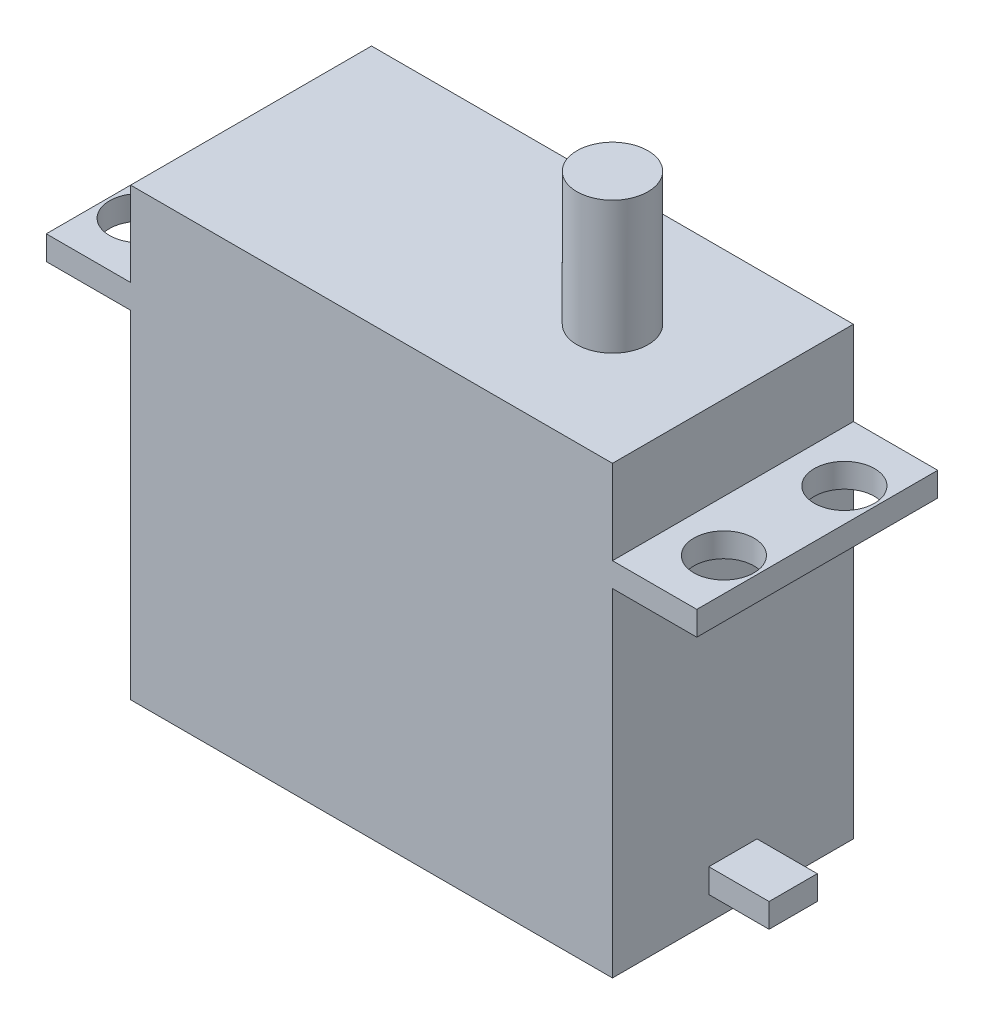
ISO-10303-21;
HEADER;
FILE_DESCRIPTION(('STEP AP214'),'2;1');
FILE_NAME('part.step','',(''),(''),'','','');
FILE_SCHEMA(('AUTOMOTIVE_DESIGN { 1 0 10303 214 1 1 1 1 }'));
ENDSEC;
DATA;
#1=APPLICATION_CONTEXT('core data for automotive mechanical design processes');
#2=APPLICATION_PROTOCOL_DEFINITION('international standard','automotive_design',2000,#1);
#3=PRODUCT_CONTEXT('',#1,'mechanical');
#4=PRODUCT('Part','Part','',(#3));
#5=PRODUCT_RELATED_PRODUCT_CATEGORY('part','',(#4));
#6=PRODUCT_DEFINITION_FORMATION('','',#4);
#7=PRODUCT_DEFINITION_CONTEXT('part definition',#1,'design');
#8=PRODUCT_DEFINITION('design','',#6,#7);
#9=PRODUCT_DEFINITION_SHAPE('','',#8);
#10=(LENGTH_UNIT() NAMED_UNIT(*) SI_UNIT(.MILLI.,.METRE.));
#11=(NAMED_UNIT(*) PLANE_ANGLE_UNIT() SI_UNIT($,.RADIAN.));
#12=(NAMED_UNIT(*) SI_UNIT($,.STERADIAN.) SOLID_ANGLE_UNIT());
#13=UNCERTAINTY_MEASURE_WITH_UNIT(LENGTH_MEASURE(1.E-05),#10,'distance_accuracy_value','');
#14=(GEOMETRIC_REPRESENTATION_CONTEXT(3) GLOBAL_UNCERTAINTY_ASSIGNED_CONTEXT((#13)) GLOBAL_UNIT_ASSIGNED_CONTEXT((#10,
#11,#12)) REPRESENTATION_CONTEXT('',''));
#15=CARTESIAN_POINT('',(0.,0.,0.));
#16=DIRECTION('',(0.,0.,1.));
#17=DIRECTION('',(1.,0.,0.));
#18=AXIS2_PLACEMENT_3D('',#15,#16,#17);
#19=CARTESIAN_POINT('',(40.,-9.,20.));
#20=DIRECTION('',(-1.,0.,0.));
#21=DIRECTION('',(0.,-1.,0.));
#22=AXIS2_PLACEMENT_3D('',#19,#20,#21);
#23=PLANE('',#22);
#24=DIRECTION('',(0.,1.,0.));
#25=VECTOR('',#24,1.);
#26=CARTESIAN_POINT('',(40.,-9.,0.));
#27=LINE('',#26,#25);
#28=CARTESIAN_POINT('',(40.,-37.,0.));
#29=VERTEX_POINT('',#28);
#30=CARTESIAN_POINT('',(40.,-9.,0.));
#31=VERTEX_POINT('',#30);
#32=EDGE_CURVE('E244',#29,#31,#27,.T.);
#33=ORIENTED_EDGE('',*,*,#32,.T.);
#34=DIRECTION('',(0.,0.,-1.));
#35=VECTOR('',#34,1.);
#36=CARTESIAN_POINT('',(40.,-9.,20.));
#37=LINE('',#36,#35);
#38=CARTESIAN_POINT('',(40.,-9.,20.));
#39=VERTEX_POINT('',#38);
#40=EDGE_CURVE('E269',#39,#31,#37,.T.);
#41=ORIENTED_EDGE('',*,*,#40,.F.);
#42=DIRECTION('',(0.,1.,0.));
#43=VECTOR('',#42,1.);
#44=CARTESIAN_POINT('',(40.,-9.,20.));
#45=LINE('',#44,#43);
#46=CARTESIAN_POINT('',(40.,-37.,20.));
#47=VERTEX_POINT('',#46);
#48=EDGE_CURVE('E219',#47,#39,#45,.T.);
#49=ORIENTED_EDGE('',*,*,#48,.F.);
#50=DIRECTION('',(0.,0.,-1.));
#51=VECTOR('',#50,1.);
#52=CARTESIAN_POINT('',(40.,-37.,20.));
#53=LINE('',#52,#51);
#54=EDGE_CURVE('E272',#47,#29,#53,.T.);
#55=ORIENTED_EDGE('',*,*,#54,.T.);
#56=EDGE_LOOP('',(#33,#41,#49,#55));
#57=FACE_BOUND('',#56,.T.);
#58=DIRECTION('',(0.,-1.,0.));
#59=VECTOR('',#58,1.);
#60=CARTESIAN_POINT('',(40.,-33.,12.));
#61=LINE('',#60,#59);
#62=CARTESIAN_POINT('',(40.,-33.,12.));
#63=VERTEX_POINT('',#62);
#64=CARTESIAN_POINT('',(40.,-35.,12.));
#65=VERTEX_POINT('',#64);
#66=EDGE_CURVE('E176',#63,#65,#61,.T.);
#67=ORIENTED_EDGE('',*,*,#66,.F.);
#68=DIRECTION('',(0.,0.,1.));
#69=VECTOR('',#68,1.);
#70=CARTESIAN_POINT('',(40.,-33.,12.));
#71=LINE('',#70,#69);
#72=CARTESIAN_POINT('',(40.,-33.,8.));
#73=VERTEX_POINT('',#72);
#74=EDGE_CURVE('E173',#73,#63,#71,.T.);
#75=ORIENTED_EDGE('',*,*,#74,.F.);
#76=DIRECTION('',(0.,1.,0.));
#77=VECTOR('',#76,1.);
#78=CARTESIAN_POINT('',(40.,-33.,8.));
#79=LINE('',#78,#77);
#80=CARTESIAN_POINT('',(40.,-35.,8.));
#81=VERTEX_POINT('',#80);
#82=EDGE_CURVE('E63',#81,#73,#79,.T.);
#83=ORIENTED_EDGE('',*,*,#82,.F.);
#84=DIRECTION('',(0.,0.,-1.));
#85=VECTOR('',#84,1.);
#86=CARTESIAN_POINT('',(40.,-35.,12.));
#87=LINE('',#86,#85);
#88=EDGE_CURVE('E58',#65,#81,#87,.T.);
#89=ORIENTED_EDGE('',*,*,#88,.F.);
#90=EDGE_LOOP('',(#67,#75,#83,#89));
#91=FACE_BOUND('',#90,.T.);
#92=ADVANCED_FACE('F41',(#57,#91),#23,.F.);
#93=CARTESIAN_POINT('',(0.,0.,20.));
#94=DIRECTION('',(1.,0.,0.));
#95=DIRECTION('',(0.,1.,0.));
#96=AXIS2_PLACEMENT_3D('',#93,#94,#95);
#97=PLANE('',#96);
#98=DIRECTION('',(0.,-1.,0.));
#99=VECTOR('',#98,1.);
#100=CARTESIAN_POINT('',(0.,0.,0.));
#101=LINE('',#100,#99);
#102=CARTESIAN_POINT('',(0.,0.,0.));
#103=VERTEX_POINT('',#102);
#104=CARTESIAN_POINT('',(0.,-7.,0.));
#105=VERTEX_POINT('',#104);
#106=EDGE_CURVE('E204',#103,#105,#101,.T.);
#107=ORIENTED_EDGE('',*,*,#106,.T.);
#108=DIRECTION('',(0.,0.,-1.));
#109=VECTOR('',#108,1.);
#110=CARTESIAN_POINT('',(0.,-7.,20.));
#111=LINE('',#110,#109);
#112=CARTESIAN_POINT('',(0.,-7.,20.));
#113=VERTEX_POINT('',#112);
#114=EDGE_CURVE('E50',#113,#105,#111,.T.);
#115=ORIENTED_EDGE('',*,*,#114,.F.);
#116=DIRECTION('',(0.,-1.,0.));
#117=VECTOR('',#116,1.);
#118=CARTESIAN_POINT('',(0.,0.,20.));
#119=LINE('',#118,#117);
#120=CARTESIAN_POINT('',(0.,0.,20.));
#121=VERTEX_POINT('',#120);
#122=EDGE_CURVE('E205',#121,#113,#119,.T.);
#123=ORIENTED_EDGE('',*,*,#122,.F.);
#124=DIRECTION('',(0.,0.,-1.));
#125=VECTOR('',#124,1.);
#126=CARTESIAN_POINT('',(0.,0.,20.));
#127=LINE('',#126,#125);
#128=EDGE_CURVE('E231',#121,#103,#127,.T.);
#129=ORIENTED_EDGE('',*,*,#128,.T.);
#130=EDGE_LOOP('',(#107,#115,#123,#129));
#131=FACE_BOUND('',#130,.T.);
#132=ADVANCED_FACE('F43',(#131),#97,.F.);
#133=CARTESIAN_POINT('',(-7.,-7.,20.));
#134=DIRECTION('',(0.,-1.,0.));
#135=DIRECTION('',(0.,0.,-1.));
#136=AXIS2_PLACEMENT_3D('',#133,#134,#135);
#137=PLANE('',#136);
#138=CARTESIAN_POINT('',(-4.25,-7.,15.));
#139=DIRECTION('',(0.,1.,0.));
#140=DIRECTION('',(0.,0.,1.));
#141=AXIS2_PLACEMENT_3D('',#138,#139,#140);
#142=CIRCLE('',#141,2.5);
#143=CARTESIAN_POINT('',(-4.25,-7.,17.5));
#144=VERTEX_POINT('',#143);
#145=EDGE_CURVE('E186',#144,#144,#142,.T.);
#146=ORIENTED_EDGE('',*,*,#145,.F.);
#147=EDGE_LOOP('',(#146));
#148=FACE_BOUND('',#147,.T.);
#149=CARTESIAN_POINT('',(-4.25,-7.,5.));
#150=DIRECTION('',(0.,1.,0.));
#151=DIRECTION('',(0.,0.,1.));
#152=AXIS2_PLACEMENT_3D('',#149,#150,#151);
#153=CIRCLE('',#152,2.5);
#154=CARTESIAN_POINT('',(-4.25,-7.,7.5));
#155=VERTEX_POINT('',#154);
#156=EDGE_CURVE('E189',#155,#155,#153,.T.);
#157=ORIENTED_EDGE('',*,*,#156,.F.);
#158=EDGE_LOOP('',(#157));
#159=FACE_BOUND('',#158,.T.);
#160=DIRECTION('',(-1.,0.,0.));
#161=VECTOR('',#160,1.);
#162=CARTESIAN_POINT('',(-7.,-7.,0.));
#163=LINE('',#162,#161);
#164=CARTESIAN_POINT('',(-7.,-7.,0.));
#165=VERTEX_POINT('',#164);
#166=EDGE_CURVE('E234',#105,#165,#163,.T.);
#167=ORIENTED_EDGE('',*,*,#166,.T.);
#168=DIRECTION('',(0.,0.,-1.));
#169=VECTOR('',#168,1.);
#170=CARTESIAN_POINT('',(-7.,-7.,20.));
#171=LINE('',#170,#169);
#172=CARTESIAN_POINT('',(-7.,-7.,20.));
#173=VERTEX_POINT('',#172);
#174=EDGE_CURVE('E284',#173,#165,#171,.T.);
#175=ORIENTED_EDGE('',*,*,#174,.F.);
#176=DIRECTION('',(-1.,0.,0.));
#177=VECTOR('',#176,1.);
#178=CARTESIAN_POINT('',(-7.,-7.,20.));
#179=LINE('',#178,#177);
#180=EDGE_CURVE('E208',#113,#173,#179,.T.);
#181=ORIENTED_EDGE('',*,*,#180,.F.);
#182=ORIENTED_EDGE('',*,*,#114,.T.);
#183=EDGE_LOOP('',(#167,#175,#181,#182));
#184=FACE_BOUND('',#183,.T.);
#185=ADVANCED_FACE('F317',(#148,#159,#184),#137,.F.);
#186=CARTESIAN_POINT('',(-7.,-7.,20.));
#187=DIRECTION('',(1.,0.,0.));
#188=DIRECTION('',(0.,1.,0.));
#189=AXIS2_PLACEMENT_3D('',#186,#187,#188);
#190=PLANE('',#189);
#191=DIRECTION('',(0.,-1.,0.));
#192=VECTOR('',#191,1.);
#193=CARTESIAN_POINT('',(-7.,-7.,0.));
#194=LINE('',#193,#192);
#195=CARTESIAN_POINT('',(-7.,-9.,0.));
#196=VERTEX_POINT('',#195);
#197=EDGE_CURVE('E236',#165,#196,#194,.T.);
#198=ORIENTED_EDGE('',*,*,#197,.T.);
#199=DIRECTION('',(0.,0.,-1.));
#200=VECTOR('',#199,1.);
#201=CARTESIAN_POINT('',(-7.,-9.,20.));
#202=LINE('',#201,#200);
#203=CARTESIAN_POINT('',(-7.,-9.,20.));
#204=VERTEX_POINT('',#203);
#205=EDGE_CURVE('E281',#204,#196,#202,.T.);
#206=ORIENTED_EDGE('',*,*,#205,.F.);
#207=DIRECTION('',(0.,-1.,0.));
#208=VECTOR('',#207,1.);
#209=CARTESIAN_POINT('',(-7.,-7.,20.));
#210=LINE('',#209,#208);
#211=EDGE_CURVE('E211',#173,#204,#210,.T.);
#212=ORIENTED_EDGE('',*,*,#211,.F.);
#213=ORIENTED_EDGE('',*,*,#174,.T.);
#214=EDGE_LOOP('',(#198,#206,#212,#213));
#215=FACE_BOUND('',#214,.T.);
#216=ADVANCED_FACE('F333',(#215),#190,.F.);
#217=CARTESIAN_POINT('',(-7.,-9.,20.));
#218=DIRECTION('',(0.,1.,0.));
#219=DIRECTION('',(0.,0.,1.));
#220=AXIS2_PLACEMENT_3D('',#217,#218,#219);
#221=PLANE('',#220);
#222=CARTESIAN_POINT('',(-4.25,-9.,15.));
#223=DIRECTION('',(0.,1.,0.));
#224=DIRECTION('',(0.,0.,1.));
#225=AXIS2_PLACEMENT_3D('',#222,#223,#224);
#226=CIRCLE('',#225,2.5);
#227=CARTESIAN_POINT('',(-4.25,-9.,17.5));
#228=VERTEX_POINT('',#227);
#229=EDGE_CURVE('E45',#228,#228,#226,.T.);
#230=ORIENTED_EDGE('',*,*,#229,.T.);
#231=EDGE_LOOP('',(#230));
#232=FACE_BOUND('',#231,.T.);
#233=CARTESIAN_POINT('',(-4.25,-9.,5.));
#234=DIRECTION('',(0.,1.,0.));
#235=DIRECTION('',(0.,0.,1.));
#236=AXIS2_PLACEMENT_3D('',#233,#234,#235);
#237=CIRCLE('',#236,2.5);
#238=CARTESIAN_POINT('',(-4.25,-9.,7.5));
#239=VERTEX_POINT('',#238);
#240=EDGE_CURVE('E200',#239,#239,#237,.T.);
#241=ORIENTED_EDGE('',*,*,#240,.T.);
#242=EDGE_LOOP('',(#241));
#243=FACE_BOUND('',#242,.T.);
#244=DIRECTION('',(1.,0.,0.));
#245=VECTOR('',#244,1.);
#246=CARTESIAN_POINT('',(-7.,-9.,0.));
#247=LINE('',#246,#245);
#248=CARTESIAN_POINT('',(0.,-9.,0.));
#249=VERTEX_POINT('',#248);
#250=EDGE_CURVE('E238',#196,#249,#247,.T.);
#251=ORIENTED_EDGE('',*,*,#250,.T.);
#252=DIRECTION('',(0.,0.,-1.));
#253=VECTOR('',#252,1.);
#254=CARTESIAN_POINT('',(0.,-9.,20.));
#255=LINE('',#254,#253);
#256=CARTESIAN_POINT('',(0.,-9.,20.));
#257=VERTEX_POINT('',#256);
#258=EDGE_CURVE('E278',#257,#249,#255,.T.);
#259=ORIENTED_EDGE('',*,*,#258,.F.);
#260=DIRECTION('',(1.,0.,0.));
#261=VECTOR('',#260,1.);
#262=CARTESIAN_POINT('',(-7.,-9.,20.));
#263=LINE('',#262,#261);
#264=EDGE_CURVE('E213',#204,#257,#263,.T.);
#265=ORIENTED_EDGE('',*,*,#264,.F.);
#266=ORIENTED_EDGE('',*,*,#205,.T.);
#267=EDGE_LOOP('',(#251,#259,#265,#266));
#268=FACE_BOUND('',#267,.T.);
#269=ADVANCED_FACE('F294',(#232,#243,#268),#221,.F.);
#270=CARTESIAN_POINT('',(0.,-9.,20.));
#271=DIRECTION('',(1.,0.,0.));
#272=DIRECTION('',(0.,1.,0.));
#273=AXIS2_PLACEMENT_3D('',#270,#271,#272);
#274=PLANE('',#273);
#275=DIRECTION('',(0.,-1.,0.));
#276=VECTOR('',#275,1.);
#277=CARTESIAN_POINT('',(0.,-9.,0.));
#278=LINE('',#277,#276);
#279=CARTESIAN_POINT('',(0.,-37.,0.));
#280=VERTEX_POINT('',#279);
#281=EDGE_CURVE('E240',#249,#280,#278,.T.);
#282=ORIENTED_EDGE('',*,*,#281,.T.);
#283=DIRECTION('',(0.,0.,-1.));
#284=VECTOR('',#283,1.);
#285=CARTESIAN_POINT('',(0.,-37.,20.));
#286=LINE('',#285,#284);
#287=CARTESIAN_POINT('',(0.,-37.,20.));
#288=VERTEX_POINT('',#287);
#289=EDGE_CURVE('E275',#288,#280,#286,.T.);
#290=ORIENTED_EDGE('',*,*,#289,.F.);
#291=DIRECTION('',(0.,-1.,0.));
#292=VECTOR('',#291,1.);
#293=CARTESIAN_POINT('',(0.,-9.,20.));
#294=LINE('',#293,#292);
#295=EDGE_CURVE('E215',#257,#288,#294,.T.);
#296=ORIENTED_EDGE('',*,*,#295,.F.);
#297=ORIENTED_EDGE('',*,*,#258,.T.);
#298=EDGE_LOOP('',(#282,#290,#296,#297));
#299=FACE_BOUND('',#298,.T.);
#300=ADVANCED_FACE('F326',(#299),#274,.F.);
#301=CARTESIAN_POINT('',(0.,-37.,20.));
#302=DIRECTION('',(0.,1.,0.));
#303=DIRECTION('',(0.,0.,1.));
#304=AXIS2_PLACEMENT_3D('',#301,#302,#303);
#305=PLANE('',#304);
#306=DIRECTION('',(1.,0.,0.));
#307=VECTOR('',#306,1.);
#308=CARTESIAN_POINT('',(0.,-37.,0.));
#309=LINE('',#308,#307);
#310=EDGE_CURVE('E242',#280,#29,#309,.T.);
#311=ORIENTED_EDGE('',*,*,#310,.T.);
#312=ORIENTED_EDGE('',*,*,#54,.F.);
#313=DIRECTION('',(1.,0.,0.));
#314=VECTOR('',#313,1.);
#315=CARTESIAN_POINT('',(0.,-37.,20.));
#316=LINE('',#315,#314);
#317=EDGE_CURVE('E217',#288,#47,#316,.T.);
#318=ORIENTED_EDGE('',*,*,#317,.F.);
#319=ORIENTED_EDGE('',*,*,#289,.T.);
#320=EDGE_LOOP('',(#311,#312,#318,#319));
#321=FACE_BOUND('',#320,.T.);
#322=ADVANCED_FACE('F323',(#321),#305,.F.);
#323=CARTESIAN_POINT('',(40.,-9.,20.));
#324=DIRECTION('',(0.,1.,0.));
#325=DIRECTION('',(0.,0.,1.));
#326=AXIS2_PLACEMENT_3D('',#323,#324,#325);
#327=PLANE('',#326);
#328=CARTESIAN_POINT('',(44.25,-9.,5.));
#329=DIRECTION('',(0.,1.,0.));
#330=DIRECTION('',(0.,0.,1.));
#331=AXIS2_PLACEMENT_3D('',#328,#329,#330);
#332=CIRCLE('',#331,2.49999999999999);
#333=CARTESIAN_POINT('',(44.25,-9.,7.49999999999999));
#334=VERTEX_POINT('',#333);
#335=EDGE_CURVE('E197',#334,#334,#332,.T.);
#336=ORIENTED_EDGE('',*,*,#335,.T.);
#337=EDGE_LOOP('',(#336));
#338=FACE_BOUND('',#337,.T.);
#339=CARTESIAN_POINT('',(44.25,-9.,15.));
#340=DIRECTION('',(0.,1.,0.));
#341=DIRECTION('',(0.,0.,1.));
#342=AXIS2_PLACEMENT_3D('',#339,#340,#341);
#343=CIRCLE('',#342,2.49999999999999);
#344=CARTESIAN_POINT('',(44.25,-9.,17.5));
#345=VERTEX_POINT('',#344);
#346=EDGE_CURVE('E194',#345,#345,#343,.T.);
#347=ORIENTED_EDGE('',*,*,#346,.T.);
#348=EDGE_LOOP('',(#347));
#349=FACE_BOUND('',#348,.T.);
#350=DIRECTION('',(1.,0.,0.));
#351=VECTOR('',#350,1.);
#352=CARTESIAN_POINT('',(40.,-9.,0.));
#353=LINE('',#352,#351);
#354=CARTESIAN_POINT('',(47.,-9.,0.));
#355=VERTEX_POINT('',#354);
#356=EDGE_CURVE('E246',#31,#355,#353,.T.);
#357=ORIENTED_EDGE('',*,*,#356,.T.);
#358=DIRECTION('',(0.,0.,-1.));
#359=VECTOR('',#358,1.);
#360=CARTESIAN_POINT('',(47.,-9.,20.));
#361=LINE('',#360,#359);
#362=CARTESIAN_POINT('',(47.,-9.,20.));
#363=VERTEX_POINT('',#362);
#364=EDGE_CURVE('E266',#363,#355,#361,.T.);
#365=ORIENTED_EDGE('',*,*,#364,.F.);
#366=DIRECTION('',(1.,0.,0.));
#367=VECTOR('',#366,1.);
#368=CARTESIAN_POINT('',(40.,-9.,20.));
#369=LINE('',#368,#367);
#370=EDGE_CURVE('E221',#39,#363,#369,.T.);
#371=ORIENTED_EDGE('',*,*,#370,.F.);
#372=ORIENTED_EDGE('',*,*,#40,.T.);
#373=EDGE_LOOP('',(#357,#365,#371,#372));
#374=FACE_BOUND('',#373,.T.);
#375=ADVANCED_FACE('F321',(#338,#349,#374),#327,.F.);
#376=CARTESIAN_POINT('',(47.,-7.,20.));
#377=DIRECTION('',(-1.,0.,0.));
#378=DIRECTION('',(0.,0.,1.));
#379=AXIS2_PLACEMENT_3D('',#376,#377,#378);
#380=PLANE('',#379);
#381=DIRECTION('',(0.,1.,0.));
#382=VECTOR('',#381,1.);
#383=CARTESIAN_POINT('',(47.,-7.,0.));
#384=LINE('',#383,#382);
#385=CARTESIAN_POINT('',(47.,-7.,0.));
#386=VERTEX_POINT('',#385);
#387=EDGE_CURVE('E248',#355,#386,#384,.T.);
#388=ORIENTED_EDGE('',*,*,#387,.T.);
#389=DIRECTION('',(0.,0.,-1.));
#390=VECTOR('',#389,1.);
#391=CARTESIAN_POINT('',(47.,-7.,20.));
#392=LINE('',#391,#390);
#393=CARTESIAN_POINT('',(47.,-7.,20.));
#394=VERTEX_POINT('',#393);
#395=EDGE_CURVE('E263',#394,#386,#392,.T.);
#396=ORIENTED_EDGE('',*,*,#395,.F.);
#397=DIRECTION('',(0.,1.,0.));
#398=VECTOR('',#397,1.);
#399=CARTESIAN_POINT('',(47.,-7.,20.));
#400=LINE('',#399,#398);
#401=EDGE_CURVE('E223',#363,#394,#400,.T.);
#402=ORIENTED_EDGE('',*,*,#401,.F.);
#403=ORIENTED_EDGE('',*,*,#364,.T.);
#404=EDGE_LOOP('',(#388,#396,#402,#403));
#405=FACE_BOUND('',#404,.T.);
#406=ADVANCED_FACE('F386',(#405),#380,.F.);
#407=CARTESIAN_POINT('',(40.,-7.,20.));
#408=DIRECTION('',(0.,-1.,0.));
#409=DIRECTION('',(0.,0.,-1.));
#410=AXIS2_PLACEMENT_3D('',#407,#408,#409);
#411=PLANE('',#410);
#412=CARTESIAN_POINT('',(44.25,-7.,5.));
#413=DIRECTION('',(0.,1.,0.));
#414=DIRECTION('',(0.,0.,1.));
#415=AXIS2_PLACEMENT_3D('',#412,#413,#414);
#416=CIRCLE('',#415,2.49999999999999);
#417=CARTESIAN_POINT('',(44.25,-7.,7.49999999999999));
#418=VERTEX_POINT('',#417);
#419=EDGE_CURVE('E180',#418,#418,#416,.T.);
#420=ORIENTED_EDGE('',*,*,#419,.F.);
#421=EDGE_LOOP('',(#420));
#422=FACE_BOUND('',#421,.T.);
#423=CARTESIAN_POINT('',(44.25,-7.,15.));
#424=DIRECTION('',(0.,1.,0.));
#425=DIRECTION('',(0.,0.,1.));
#426=AXIS2_PLACEMENT_3D('',#423,#424,#425);
#427=CIRCLE('',#426,2.49999999999999);
#428=CARTESIAN_POINT('',(44.25,-7.,17.5));
#429=VERTEX_POINT('',#428);
#430=EDGE_CURVE('E177',#429,#429,#427,.T.);
#431=ORIENTED_EDGE('',*,*,#430,.F.);
#432=EDGE_LOOP('',(#431));
#433=FACE_BOUND('',#432,.T.);
#434=DIRECTION('',(-1.,0.,0.));
#435=VECTOR('',#434,1.);
#436=CARTESIAN_POINT('',(40.,-7.,0.));
#437=LINE('',#436,#435);
#438=CARTESIAN_POINT('',(40.,-7.,0.));
#439=VERTEX_POINT('',#438);
#440=EDGE_CURVE('E250',#386,#439,#437,.T.);
#441=ORIENTED_EDGE('',*,*,#440,.T.);
#442=DIRECTION('',(0.,0.,-1.));
#443=VECTOR('',#442,1.);
#444=CARTESIAN_POINT('',(40.,-7.,20.));
#445=LINE('',#444,#443);
#446=CARTESIAN_POINT('',(40.,-7.,20.));
#447=VERTEX_POINT('',#446);
#448=EDGE_CURVE('E260',#447,#439,#445,.T.);
#449=ORIENTED_EDGE('',*,*,#448,.F.);
#450=DIRECTION('',(-1.,0.,0.));
#451=VECTOR('',#450,1.);
#452=CARTESIAN_POINT('',(40.,-7.,20.));
#453=LINE('',#452,#451);
#454=EDGE_CURVE('E225',#394,#447,#453,.T.);
#455=ORIENTED_EDGE('',*,*,#454,.F.);
#456=ORIENTED_EDGE('',*,*,#395,.T.);
#457=EDGE_LOOP('',(#441,#449,#455,#456));
#458=FACE_BOUND('',#457,.T.);
#459=ADVANCED_FACE('F380',(#422,#433,#458),#411,.F.);
#460=CARTESIAN_POINT('',(40.,0.,20.));
#461=DIRECTION('',(-1.,0.,0.));
#462=DIRECTION('',(0.,0.,1.));
#463=AXIS2_PLACEMENT_3D('',#460,#461,#462);
#464=PLANE('',#463);
#465=DIRECTION('',(0.,1.,0.));
#466=VECTOR('',#465,1.);
#467=CARTESIAN_POINT('',(40.,0.,0.));
#468=LINE('',#467,#466);
#469=CARTESIAN_POINT('',(40.,0.,0.));
#470=VERTEX_POINT('',#469);
#471=EDGE_CURVE('E252',#439,#470,#468,.T.);
#472=ORIENTED_EDGE('',*,*,#471,.T.);
#473=DIRECTION('',(0.,0.,-1.));
#474=VECTOR('',#473,1.);
#475=CARTESIAN_POINT('',(40.,0.,20.));
#476=LINE('',#475,#474);
#477=CARTESIAN_POINT('',(40.,0.,20.));
#478=VERTEX_POINT('',#477);
#479=EDGE_CURVE('E257',#478,#470,#476,.T.);
#480=ORIENTED_EDGE('',*,*,#479,.F.);
#481=DIRECTION('',(0.,1.,0.));
#482=VECTOR('',#481,1.);
#483=CARTESIAN_POINT('',(40.,0.,20.));
#484=LINE('',#483,#482);
#485=EDGE_CURVE('E227',#447,#478,#484,.T.);
#486=ORIENTED_EDGE('',*,*,#485,.F.);
#487=ORIENTED_EDGE('',*,*,#448,.T.);
#488=EDGE_LOOP('',(#472,#480,#486,#487));
#489=FACE_BOUND('',#488,.T.);
#490=ADVANCED_FACE('F376',(#489),#464,.F.);
#491=CARTESIAN_POINT('',(0.,0.,20.));
#492=DIRECTION('',(0.,-1.,0.));
#493=DIRECTION('',(0.,0.,-1.));
#494=AXIS2_PLACEMENT_3D('',#491,#492,#493);
#495=PLANE('',#494);
#496=CARTESIAN_POINT('',(30.,0.,10.));
#497=DIRECTION('',(0.,-1.,0.));
#498=DIRECTION('',(0.,0.,-1.));
#499=AXIS2_PLACEMENT_3D('',#496,#497,#498);
#500=CIRCLE('',#499,2.95000000000001);
#501=CARTESIAN_POINT('',(30.,0.,7.04999999999999));
#502=VERTEX_POINT('',#501);
#503=EDGE_CURVE('E11',#502,#502,#500,.F.);
#504=ORIENTED_EDGE('',*,*,#503,.F.);
#505=EDGE_LOOP('',(#504));
#506=FACE_BOUND('',#505,.T.);
#507=DIRECTION('',(-1.,0.,0.));
#508=VECTOR('',#507,1.);
#509=CARTESIAN_POINT('',(0.,0.,0.));
#510=LINE('',#509,#508);
#511=EDGE_CURVE('E209',#470,#103,#510,.T.);
#512=ORIENTED_EDGE('',*,*,#511,.T.);
#513=ORIENTED_EDGE('',*,*,#128,.F.);
#514=DIRECTION('',(-1.,0.,0.));
#515=VECTOR('',#514,1.);
#516=CARTESIAN_POINT('',(0.,0.,20.));
#517=LINE('',#516,#515);
#518=EDGE_CURVE('E229',#478,#121,#517,.T.);
#519=ORIENTED_EDGE('',*,*,#518,.F.);
#520=ORIENTED_EDGE('',*,*,#479,.T.);
#521=EDGE_LOOP('',(#512,#513,#519,#520));
#522=FACE_BOUND('',#521,.T.);
#523=ADVANCED_FACE('F372',(#506,#522),#495,.F.);
#524=CARTESIAN_POINT('',(0.,0.,20.));
#525=DIRECTION('',(0.,0.,1.));
#526=DIRECTION('',(1.,0.,0.));
#527=AXIS2_PLACEMENT_3D('',#524,#525,#526);
#528=PLANE('',#527);
#529=ORIENTED_EDGE('',*,*,#122,.T.);
#530=ORIENTED_EDGE('',*,*,#180,.T.);
#531=ORIENTED_EDGE('',*,*,#211,.T.);
#532=ORIENTED_EDGE('',*,*,#264,.T.);
#533=ORIENTED_EDGE('',*,*,#295,.T.);
#534=ORIENTED_EDGE('',*,*,#317,.T.);
#535=ORIENTED_EDGE('',*,*,#48,.T.);
#536=ORIENTED_EDGE('',*,*,#370,.T.);
#537=ORIENTED_EDGE('',*,*,#401,.T.);
#538=ORIENTED_EDGE('',*,*,#454,.T.);
#539=ORIENTED_EDGE('',*,*,#485,.T.);
#540=ORIENTED_EDGE('',*,*,#518,.T.);
#541=EDGE_LOOP('',(#529,#530,#531,#532,#533,#534,#535,#536,#537,#538,#539,#540));
#542=FACE_BOUND('',#541,.T.);
#543=ADVANCED_FACE('F363',(#542),#528,.T.);
#544=CARTESIAN_POINT('',(0.,0.,0.));
#545=DIRECTION('',(0.,0.,1.));
#546=DIRECTION('',(1.,0.,0.));
#547=AXIS2_PLACEMENT_3D('',#544,#545,#546);
#548=PLANE('',#547);
#549=ORIENTED_EDGE('',*,*,#106,.F.);
#550=ORIENTED_EDGE('',*,*,#511,.F.);
#551=ORIENTED_EDGE('',*,*,#471,.F.);
#552=ORIENTED_EDGE('',*,*,#440,.F.);
#553=ORIENTED_EDGE('',*,*,#387,.F.);
#554=ORIENTED_EDGE('',*,*,#356,.F.);
#555=ORIENTED_EDGE('',*,*,#32,.F.);
#556=ORIENTED_EDGE('',*,*,#310,.F.);
#557=ORIENTED_EDGE('',*,*,#281,.F.);
#558=ORIENTED_EDGE('',*,*,#250,.F.);
#559=ORIENTED_EDGE('',*,*,#197,.F.);
#560=ORIENTED_EDGE('',*,*,#166,.F.);
#561=EDGE_LOOP('',(#549,#550,#551,#552,#553,#554,#555,#556,#557,#558,#559,#560));
#562=FACE_BOUND('',#561,.T.);
#563=ADVANCED_FACE('F353',(#562),#548,.F.);
#564=CARTESIAN_POINT('',(30.,11.,10.));
#565=DIRECTION('',(0.,-1.,0.));
#566=DIRECTION('',(0.,0.,-1.));
#567=AXIS2_PLACEMENT_3D('',#564,#565,#566);
#568=CYLINDRICAL_SURFACE('',#567,2.95000000000001);
#569=CARTESIAN_POINT('',(30.,11.,10.));
#570=DIRECTION('',(0.,1.,0.));
#571=DIRECTION('',(0.,0.,1.));
#572=AXIS2_PLACEMENT_3D('',#569,#570,#571);
#573=CIRCLE('',#572,2.95000000000001);
#574=CARTESIAN_POINT('',(30.,11.,12.95));
#575=VERTEX_POINT('',#574);
#576=EDGE_CURVE('E201',#575,#575,#573,.T.);
#577=ORIENTED_EDGE('',*,*,#576,.F.);
#578=EDGE_LOOP('',(#577));
#579=FACE_BOUND('',#578,.T.);
#580=ORIENTED_EDGE('',*,*,#503,.T.);
#581=EDGE_LOOP('',(#580));
#582=FACE_BOUND('',#581,.T.);
#583=ADVANCED_FACE('F411',(#579,#582),#568,.T.);
#584=CARTESIAN_POINT('',(30.,11.,10.));
#585=DIRECTION('',(0.,1.,0.));
#586=DIRECTION('',(0.,0.,1.));
#587=AXIS2_PLACEMENT_3D('',#584,#585,#586);
#588=PLANE('',#587);
#589=ORIENTED_EDGE('',*,*,#576,.T.);
#590=EDGE_LOOP('',(#589));
#591=FACE_BOUND('',#590,.T.);
#592=ADVANCED_FACE('F405',(#591),#588,.T.);
#593=CARTESIAN_POINT('',(44.25,-10.,15.));
#594=DIRECTION('',(0.,1.,0.));
#595=DIRECTION('',(0.,0.,1.));
#596=AXIS2_PLACEMENT_3D('',#593,#594,#595);
#597=CYLINDRICAL_SURFACE('',#596,2.49999999999999);
#598=ORIENTED_EDGE('',*,*,#430,.T.);
#599=EDGE_LOOP('',(#598));
#600=FACE_BOUND('',#599,.T.);
#601=ORIENTED_EDGE('',*,*,#346,.F.);
#602=EDGE_LOOP('',(#601));
#603=FACE_BOUND('',#602,.T.);
#604=ADVANCED_FACE('F403',(#600,#603),#597,.F.);
#605=CARTESIAN_POINT('',(44.25,-10.,5.));
#606=DIRECTION('',(0.,1.,0.));
#607=DIRECTION('',(0.,0.,1.));
#608=AXIS2_PLACEMENT_3D('',#605,#606,#607);
#609=CYLINDRICAL_SURFACE('',#608,2.49999999999999);
#610=ORIENTED_EDGE('',*,*,#419,.T.);
#611=EDGE_LOOP('',(#610));
#612=FACE_BOUND('',#611,.T.);
#613=ORIENTED_EDGE('',*,*,#335,.F.);
#614=EDGE_LOOP('',(#613));
#615=FACE_BOUND('',#614,.T.);
#616=ADVANCED_FACE('F307',(#612,#615),#609,.F.);
#617=CARTESIAN_POINT('',(-4.25,-10.,5.));
#618=DIRECTION('',(0.,1.,0.));
#619=DIRECTION('',(0.,0.,1.));
#620=AXIS2_PLACEMENT_3D('',#617,#618,#619);
#621=CYLINDRICAL_SURFACE('',#620,2.5);
#622=ORIENTED_EDGE('',*,*,#156,.T.);
#623=EDGE_LOOP('',(#622));
#624=FACE_BOUND('',#623,.T.);
#625=ORIENTED_EDGE('',*,*,#240,.F.);
#626=EDGE_LOOP('',(#625));
#627=FACE_BOUND('',#626,.T.);
#628=ADVANCED_FACE('F298',(#624,#627),#621,.F.);
#629=CARTESIAN_POINT('',(-4.25,-10.,15.));
#630=DIRECTION('',(0.,1.,0.));
#631=DIRECTION('',(0.,0.,1.));
#632=AXIS2_PLACEMENT_3D('',#629,#630,#631);
#633=CYLINDRICAL_SURFACE('',#632,2.5);
#634=ORIENTED_EDGE('',*,*,#145,.T.);
#635=EDGE_LOOP('',(#634));
#636=FACE_BOUND('',#635,.T.);
#637=ORIENTED_EDGE('',*,*,#229,.F.);
#638=EDGE_LOOP('',(#637));
#639=FACE_BOUND('',#638,.T.);
#640=ADVANCED_FACE('F296',(#636,#639),#633,.F.);
#641=CARTESIAN_POINT('',(45.,-33.,12.));
#642=DIRECTION('',(0.,0.,-1.));
#643=DIRECTION('',(-1.,0.,0.));
#644=AXIS2_PLACEMENT_3D('',#641,#642,#643);
#645=PLANE('',#644);
#646=ORIENTED_EDGE('',*,*,#66,.T.);
#647=DIRECTION('',(-1.,0.,0.));
#648=VECTOR('',#647,1.);
#649=CARTESIAN_POINT('',(45.,-35.,12.));
#650=LINE('',#649,#648);
#651=CARTESIAN_POINT('',(45.,-35.,12.));
#652=VERTEX_POINT('',#651);
#653=EDGE_CURVE('E157',#652,#65,#650,.T.);
#654=ORIENTED_EDGE('',*,*,#653,.F.);
#655=DIRECTION('',(0.,-1.,0.));
#656=VECTOR('',#655,1.);
#657=CARTESIAN_POINT('',(45.,-33.,12.));
#658=LINE('',#657,#656);
#659=CARTESIAN_POINT('',(45.,-33.,12.));
#660=VERTEX_POINT('',#659);
#661=EDGE_CURVE('E164',#660,#652,#658,.T.);
#662=ORIENTED_EDGE('',*,*,#661,.F.);
#663=DIRECTION('',(-1.,0.,0.));
#664=VECTOR('',#663,1.);
#665=CARTESIAN_POINT('',(45.,-33.,12.));
#666=LINE('',#665,#664);
#667=EDGE_CURVE('E601',#660,#63,#666,.T.);
#668=ORIENTED_EDGE('',*,*,#667,.T.);
#669=EDGE_LOOP('',(#646,#654,#662,#668));
#670=FACE_BOUND('',#669,.T.);
#671=ADVANCED_FACE('F175',(#670),#645,.F.);
#672=CARTESIAN_POINT('',(45.,-35.,12.));
#673=DIRECTION('',(0.,1.,0.));
#674=DIRECTION('',(-1.,0.,0.));
#675=AXIS2_PLACEMENT_3D('',#672,#673,#674);
#676=PLANE('',#675);
#677=ORIENTED_EDGE('',*,*,#88,.T.);
#678=DIRECTION('',(-1.,0.,0.));
#679=VECTOR('',#678,1.);
#680=CARTESIAN_POINT('',(45.,-35.,8.));
#681=LINE('',#680,#679);
#682=CARTESIAN_POINT('',(45.,-35.,8.));
#683=VERTEX_POINT('',#682);
#684=EDGE_CURVE('E160',#683,#81,#681,.T.);
#685=ORIENTED_EDGE('',*,*,#684,.F.);
#686=DIRECTION('',(0.,0.,-1.));
#687=VECTOR('',#686,1.);
#688=CARTESIAN_POINT('',(45.,-35.,12.));
#689=LINE('',#688,#687);
#690=EDGE_CURVE('E153',#652,#683,#689,.T.);
#691=ORIENTED_EDGE('',*,*,#690,.F.);
#692=ORIENTED_EDGE('',*,*,#653,.T.);
#693=EDGE_LOOP('',(#677,#685,#691,#692));
#694=FACE_BOUND('',#693,.T.);
#695=ADVANCED_FACE('F155',(#694),#676,.F.);
#696=CARTESIAN_POINT('',(45.,-33.,8.));
#697=DIRECTION('',(0.,0.,1.));
#698=DIRECTION('',(0.,-1.,0.));
#699=AXIS2_PLACEMENT_3D('',#696,#697,#698);
#700=PLANE('',#699);
#701=ORIENTED_EDGE('',*,*,#82,.T.);
#702=DIRECTION('',(-1.,0.,0.));
#703=VECTOR('',#702,1.);
#704=CARTESIAN_POINT('',(45.,-33.,8.));
#705=LINE('',#704,#703);
#706=CARTESIAN_POINT('',(45.,-33.,8.));
#707=VERTEX_POINT('',#706);
#708=EDGE_CURVE('E182',#707,#73,#705,.T.);
#709=ORIENTED_EDGE('',*,*,#708,.F.);
#710=DIRECTION('',(0.,1.,0.));
#711=VECTOR('',#710,1.);
#712=CARTESIAN_POINT('',(45.,-33.,8.));
#713=LINE('',#712,#711);
#714=EDGE_CURVE('E163',#683,#707,#713,.T.);
#715=ORIENTED_EDGE('',*,*,#714,.F.);
#716=ORIENTED_EDGE('',*,*,#684,.T.);
#717=EDGE_LOOP('',(#701,#709,#715,#716));
#718=FACE_BOUND('',#717,.T.);
#719=ADVANCED_FACE('F417',(#718),#700,.F.);
#720=CARTESIAN_POINT('',(45.,-33.,12.));
#721=DIRECTION('',(0.,-1.,0.));
#722=DIRECTION('',(1.,0.,0.));
#723=AXIS2_PLACEMENT_3D('',#720,#721,#722);
#724=PLANE('',#723);
#725=ORIENTED_EDGE('',*,*,#74,.T.);
#726=ORIENTED_EDGE('',*,*,#667,.F.);
#727=DIRECTION('',(0.,0.,1.));
#728=VECTOR('',#727,1.);
#729=CARTESIAN_POINT('',(45.,-33.,12.));
#730=LINE('',#729,#728);
#731=EDGE_CURVE('E169',#707,#660,#730,.T.);
#732=ORIENTED_EDGE('',*,*,#731,.F.);
#733=ORIENTED_EDGE('',*,*,#708,.T.);
#734=EDGE_LOOP('',(#725,#726,#732,#733));
#735=FACE_BOUND('',#734,.T.);
#736=ADVANCED_FACE('F420',(#735),#724,.F.);
#737=CARTESIAN_POINT('',(45.,0.,0.));
#738=DIRECTION('',(1.,0.,0.));
#739=DIRECTION('',(0.,0.,-1.));
#740=AXIS2_PLACEMENT_3D('',#737,#738,#739);
#741=PLANE('',#740);
#742=ORIENTED_EDGE('',*,*,#661,.T.);
#743=ORIENTED_EDGE('',*,*,#690,.T.);
#744=ORIENTED_EDGE('',*,*,#714,.T.);
#745=ORIENTED_EDGE('',*,*,#731,.T.);
#746=EDGE_LOOP('',(#742,#743,#744,#745));
#747=FACE_BOUND('',#746,.T.);
#748=ADVANCED_FACE('F167',(#747),#741,.T.);
#749=CLOSED_SHELL('',(#92,#132,#185,#216,#269,#300,#322,#375,#406,#459,#490,#523,#543,#563,#583,
#592,#604,#616,#628,#640,#671,#695,#719,#736,#748));
#750=MANIFOLD_SOLID_BREP('B2',#749);
#751=ADVANCED_BREP_SHAPE_REPRESENTATION('',(#18,#750),#14);
#752=SHAPE_DEFINITION_REPRESENTATION(#9,#751);
ENDSEC;
END-ISO-10303-21;
